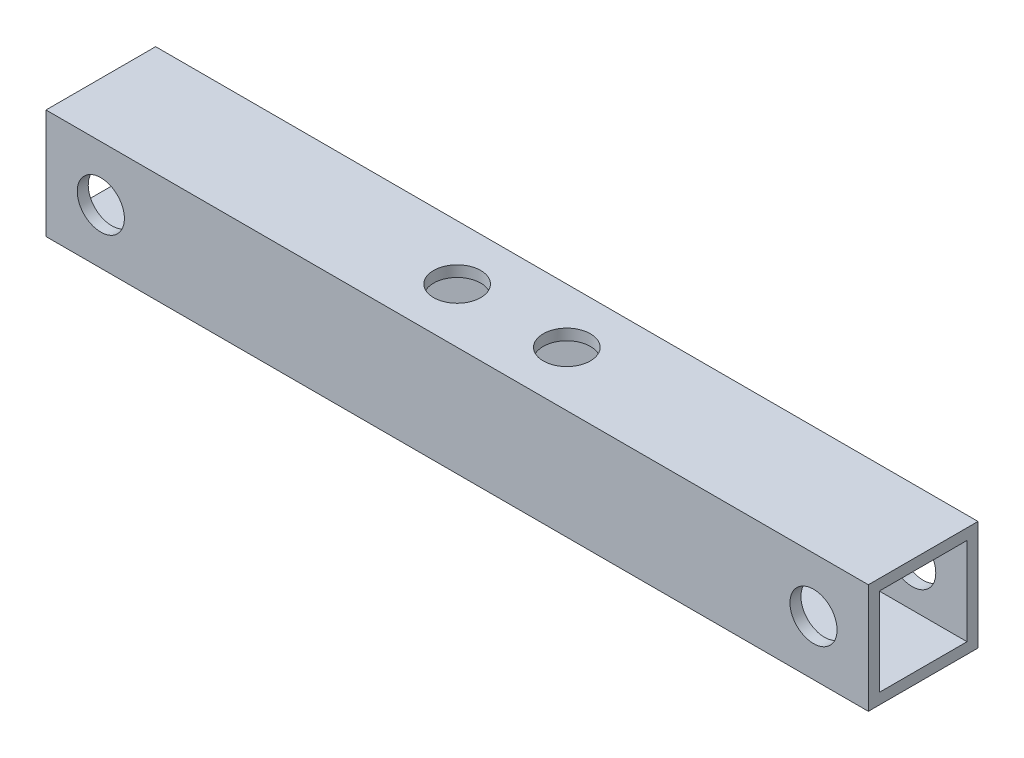
ISO-10303-21;
HEADER;
FILE_DESCRIPTION(('STEP AP214'),'2;1');
FILE_NAME('part.step','',(''),(''),'','','');
FILE_SCHEMA(('AUTOMOTIVE_DESIGN { 1 0 10303 214 1 1 1 1 }'));
ENDSEC;
DATA;
#1=APPLICATION_CONTEXT('core data for automotive mechanical design processes');
#2=APPLICATION_PROTOCOL_DEFINITION('international standard','automotive_design',2000,#1);
#3=PRODUCT_CONTEXT('',#1,'mechanical');
#4=PRODUCT('Part','Part','',(#3));
#5=PRODUCT_RELATED_PRODUCT_CATEGORY('part','',(#4));
#6=PRODUCT_DEFINITION_FORMATION('','',#4);
#7=PRODUCT_DEFINITION_CONTEXT('part definition',#1,'design');
#8=PRODUCT_DEFINITION('design','',#6,#7);
#9=PRODUCT_DEFINITION_SHAPE('','',#8);
#10=(LENGTH_UNIT() NAMED_UNIT(*) SI_UNIT(.MILLI.,.METRE.));
#11=(NAMED_UNIT(*) PLANE_ANGLE_UNIT() SI_UNIT($,.RADIAN.));
#12=(NAMED_UNIT(*) SI_UNIT($,.STERADIAN.) SOLID_ANGLE_UNIT());
#13=UNCERTAINTY_MEASURE_WITH_UNIT(LENGTH_MEASURE(1.E-05),#10,'distance_accuracy_value','');
#14=(GEOMETRIC_REPRESENTATION_CONTEXT(3) GLOBAL_UNCERTAINTY_ASSIGNED_CONTEXT((#13)) GLOBAL_UNIT_ASSIGNED_CONTEXT((#10,
#11,#12)) REPRESENTATION_CONTEXT('',''));
#15=CARTESIAN_POINT('',(0.,0.,0.));
#16=DIRECTION('',(0.,0.,1.));
#17=DIRECTION('',(1.,0.,0.));
#18=AXIS2_PLACEMENT_3D('',#15,#16,#17);
#19=CARTESIAN_POINT('',(75.,0.,0.));
#20=DIRECTION('',(1.,0.,0.));
#21=DIRECTION('',(0.,0.,-1.));
#22=AXIS2_PLACEMENT_3D('',#19,#20,#21);
#23=PLANE('',#22);
#24=DIRECTION('',(0.,1.,0.));
#25=VECTOR('',#24,1.);
#26=CARTESIAN_POINT('',(75.,5.,-5.));
#27=LINE('',#26,#25);
#28=CARTESIAN_POINT('',(75.,-5.,-5.));
#29=VERTEX_POINT('',#28);
#30=CARTESIAN_POINT('',(75.,5.,-5.));
#31=VERTEX_POINT('',#30);
#32=EDGE_CURVE('E163',#29,#31,#27,.T.);
#33=ORIENTED_EDGE('',*,*,#32,.T.);
#34=DIRECTION('',(0.,0.,1.));
#35=VECTOR('',#34,1.);
#36=CARTESIAN_POINT('',(75.,5.,5.));
#37=LINE('',#36,#35);
#38=CARTESIAN_POINT('',(75.,5.,5.));
#39=VERTEX_POINT('',#38);
#40=EDGE_CURVE('E166',#31,#39,#37,.T.);
#41=ORIENTED_EDGE('',*,*,#40,.T.);
#42=DIRECTION('',(0.,-1.,0.));
#43=VECTOR('',#42,1.);
#44=CARTESIAN_POINT('',(75.,5.,5.));
#45=LINE('',#44,#43);
#46=CARTESIAN_POINT('',(75.,-5.,5.));
#47=VERTEX_POINT('',#46);
#48=EDGE_CURVE('E169',#39,#47,#45,.T.);
#49=ORIENTED_EDGE('',*,*,#48,.T.);
#50=DIRECTION('',(0.,0.,-1.));
#51=VECTOR('',#50,1.);
#52=CARTESIAN_POINT('',(75.,-5.,5.));
#53=LINE('',#52,#51);
#54=EDGE_CURVE('E171',#47,#29,#53,.T.);
#55=ORIENTED_EDGE('',*,*,#54,.T.);
#56=EDGE_LOOP('',(#33,#41,#49,#55));
#57=FACE_BOUND('',#56,.T.);
#58=DIRECTION('',(0.,0.,1.));
#59=VECTOR('',#58,1.);
#60=CARTESIAN_POINT('',(75.,4.,5.));
#61=LINE('',#60,#59);
#62=CARTESIAN_POINT('',(75.,4.,-4.));
#63=VERTEX_POINT('',#62);
#64=CARTESIAN_POINT('',(75.,4.,4.));
#65=VERTEX_POINT('',#64);
#66=EDGE_CURVE('E133',#63,#65,#61,.T.);
#67=ORIENTED_EDGE('',*,*,#66,.F.);
#68=DIRECTION('',(0.,1.,0.));
#69=VECTOR('',#68,1.);
#70=CARTESIAN_POINT('',(75.,5.,-4.));
#71=LINE('',#70,#69);
#72=CARTESIAN_POINT('',(75.,-4.,-4.));
#73=VERTEX_POINT('',#72);
#74=EDGE_CURVE('E125',#73,#63,#71,.T.);
#75=ORIENTED_EDGE('',*,*,#74,.F.);
#76=DIRECTION('',(0.,0.,-1.));
#77=VECTOR('',#76,1.);
#78=CARTESIAN_POINT('',(75.,-4.,5.));
#79=LINE('',#78,#77);
#80=CARTESIAN_POINT('',(75.,-4.,4.));
#81=VERTEX_POINT('',#80);
#82=EDGE_CURVE('E147',#81,#73,#79,.T.);
#83=ORIENTED_EDGE('',*,*,#82,.F.);
#84=DIRECTION('',(0.,-1.,0.));
#85=VECTOR('',#84,1.);
#86=CARTESIAN_POINT('',(75.,5.,4.));
#87=LINE('',#86,#85);
#88=EDGE_CURVE('E145',#65,#81,#87,.T.);
#89=ORIENTED_EDGE('',*,*,#88,.F.);
#90=EDGE_LOOP('',(#67,#75,#83,#89));
#91=FACE_BOUND('',#90,.T.);
#92=ADVANCED_FACE('F58',(#57,#91),#23,.T.);
#93=CARTESIAN_POINT('',(0.,0.,0.));
#94=DIRECTION('',(1.,0.,0.));
#95=DIRECTION('',(0.,0.,-1.));
#96=AXIS2_PLACEMENT_3D('',#93,#94,#95);
#97=PLANE('',#96);
#98=DIRECTION('',(0.,1.,0.));
#99=VECTOR('',#98,1.);
#100=CARTESIAN_POINT('',(0.,5.,-5.));
#101=LINE('',#100,#99);
#102=CARTESIAN_POINT('',(0.,-5.,-5.));
#103=VERTEX_POINT('',#102);
#104=CARTESIAN_POINT('',(0.,5.,-5.));
#105=VERTEX_POINT('',#104);
#106=EDGE_CURVE('E141',#103,#105,#101,.T.);
#107=ORIENTED_EDGE('',*,*,#106,.F.);
#108=DIRECTION('',(0.,0.,-1.));
#109=VECTOR('',#108,1.);
#110=CARTESIAN_POINT('',(0.,-5.,5.));
#111=LINE('',#110,#109);
#112=CARTESIAN_POINT('',(0.,-5.,5.));
#113=VERTEX_POINT('',#112);
#114=EDGE_CURVE('E167',#113,#103,#111,.T.);
#115=ORIENTED_EDGE('',*,*,#114,.F.);
#116=DIRECTION('',(0.,-1.,0.));
#117=VECTOR('',#116,1.);
#118=CARTESIAN_POINT('',(0.,5.,5.));
#119=LINE('',#118,#117);
#120=CARTESIAN_POINT('',(0.,5.,5.));
#121=VERTEX_POINT('',#120);
#122=EDGE_CURVE('E178',#121,#113,#119,.T.);
#123=ORIENTED_EDGE('',*,*,#122,.F.);
#124=DIRECTION('',(0.,0.,1.));
#125=VECTOR('',#124,1.);
#126=CARTESIAN_POINT('',(0.,5.,5.));
#127=LINE('',#126,#125);
#128=EDGE_CURVE('E176',#105,#121,#127,.T.);
#129=ORIENTED_EDGE('',*,*,#128,.F.);
#130=EDGE_LOOP('',(#107,#115,#123,#129));
#131=FACE_BOUND('',#130,.T.);
#132=DIRECTION('',(0.,1.,0.));
#133=VECTOR('',#132,1.);
#134=CARTESIAN_POINT('',(0.,5.,-4.));
#135=LINE('',#134,#133);
#136=CARTESIAN_POINT('',(0.,-4.,-4.));
#137=VERTEX_POINT('',#136);
#138=CARTESIAN_POINT('',(0.,4.,-4.));
#139=VERTEX_POINT('',#138);
#140=EDGE_CURVE('E83',#137,#139,#135,.T.);
#141=ORIENTED_EDGE('',*,*,#140,.T.);
#142=DIRECTION('',(0.,0.,1.));
#143=VECTOR('',#142,1.);
#144=CARTESIAN_POINT('',(0.,4.,5.));
#145=LINE('',#144,#143);
#146=CARTESIAN_POINT('',(0.,4.,4.));
#147=VERTEX_POINT('',#146);
#148=EDGE_CURVE('E140',#139,#147,#145,.T.);
#149=ORIENTED_EDGE('',*,*,#148,.T.);
#150=DIRECTION('',(0.,-1.,0.));
#151=VECTOR('',#150,1.);
#152=CARTESIAN_POINT('',(0.,5.,4.));
#153=LINE('',#152,#151);
#154=CARTESIAN_POINT('',(0.,-4.,4.));
#155=VERTEX_POINT('',#154);
#156=EDGE_CURVE('E155',#147,#155,#153,.T.);
#157=ORIENTED_EDGE('',*,*,#156,.T.);
#158=DIRECTION('',(0.,0.,-1.));
#159=VECTOR('',#158,1.);
#160=CARTESIAN_POINT('',(0.,-4.,5.));
#161=LINE('',#160,#159);
#162=EDGE_CURVE('E134',#155,#137,#161,.T.);
#163=ORIENTED_EDGE('',*,*,#162,.T.);
#164=EDGE_LOOP('',(#141,#149,#157,#163));
#165=FACE_BOUND('',#164,.T.);
#166=ADVANCED_FACE('F255',(#131,#165),#97,.F.);
#167=CARTESIAN_POINT('',(75.,5.,-5.));
#168=DIRECTION('',(0.,0.,1.));
#169=DIRECTION('',(0.,-1.,0.));
#170=AXIS2_PLACEMENT_3D('',#167,#168,#169);
#171=PLANE('',#170);
#172=CARTESIAN_POINT('',(70.,0.,-5.));
#173=DIRECTION('',(0.,0.,1.));
#174=DIRECTION('',(1.,0.,0.));
#175=AXIS2_PLACEMENT_3D('',#172,#173,#174);
#176=CIRCLE('',#175,2.15);
#177=CARTESIAN_POINT('',(72.15,0.,-5.));
#178=VERTEX_POINT('',#177);
#179=EDGE_CURVE('E192',#178,#178,#176,.T.);
#180=ORIENTED_EDGE('',*,*,#179,.T.);
#181=EDGE_LOOP('',(#180));
#182=FACE_BOUND('',#181,.T.);
#183=CARTESIAN_POINT('',(5.,0.,-5.));
#184=DIRECTION('',(0.,0.,1.));
#185=DIRECTION('',(-1.,0.,0.));
#186=AXIS2_PLACEMENT_3D('',#183,#184,#185);
#187=CIRCLE('',#186,2.15);
#188=CARTESIAN_POINT('',(2.85,0.,-5.));
#189=VERTEX_POINT('',#188);
#190=EDGE_CURVE('E226',#189,#189,#187,.T.);
#191=ORIENTED_EDGE('',*,*,#190,.T.);
#192=EDGE_LOOP('',(#191));
#193=FACE_BOUND('',#192,.T.);
#194=ORIENTED_EDGE('',*,*,#106,.T.);
#195=DIRECTION('',(-1.,0.,0.));
#196=VECTOR('',#195,1.);
#197=CARTESIAN_POINT('',(75.,5.,-5.));
#198=LINE('',#197,#196);
#199=EDGE_CURVE('E12',#31,#105,#198,.T.);
#200=ORIENTED_EDGE('',*,*,#199,.F.);
#201=ORIENTED_EDGE('',*,*,#32,.F.);
#202=DIRECTION('',(-1.,0.,0.));
#203=VECTOR('',#202,1.);
#204=CARTESIAN_POINT('',(75.,-5.,-5.));
#205=LINE('',#204,#203);
#206=EDGE_CURVE('E173',#29,#103,#205,.T.);
#207=ORIENTED_EDGE('',*,*,#206,.T.);
#208=EDGE_LOOP('',(#194,#200,#201,#207));
#209=FACE_BOUND('',#208,.T.);
#210=ADVANCED_FACE('F60',(#182,#193,#209),#171,.F.);
#211=CARTESIAN_POINT('',(75.,5.,5.));
#212=DIRECTION('',(0.,-1.,0.));
#213=DIRECTION('',(0.,0.,-1.));
#214=AXIS2_PLACEMENT_3D('',#211,#212,#213);
#215=PLANE('',#214);
#216=CARTESIAN_POINT('',(42.5,5.,0.));
#217=DIRECTION('',(0.,1.,0.));
#218=DIRECTION('',(0.,0.,1.));
#219=AXIS2_PLACEMENT_3D('',#216,#217,#218);
#220=CIRCLE('',#219,2.15);
#221=CARTESIAN_POINT('',(42.5,5.,2.15));
#222=VERTEX_POINT('',#221);
#223=EDGE_CURVE('E204',#222,#222,#220,.T.);
#224=ORIENTED_EDGE('',*,*,#223,.F.);
#225=EDGE_LOOP('',(#224));
#226=FACE_BOUND('',#225,.T.);
#227=CARTESIAN_POINT('',(32.5,5.,0.));
#228=DIRECTION('',(0.,1.,0.));
#229=DIRECTION('',(0.,0.,-1.));
#230=AXIS2_PLACEMENT_3D('',#227,#228,#229);
#231=CIRCLE('',#230,2.15);
#232=CARTESIAN_POINT('',(32.5,5.,-2.15));
#233=VERTEX_POINT('',#232);
#234=EDGE_CURVE('E214',#233,#233,#231,.T.);
#235=ORIENTED_EDGE('',*,*,#234,.F.);
#236=EDGE_LOOP('',(#235));
#237=FACE_BOUND('',#236,.T.);
#238=ORIENTED_EDGE('',*,*,#128,.T.);
#239=DIRECTION('',(-1.,0.,0.));
#240=VECTOR('',#239,1.);
#241=CARTESIAN_POINT('',(75.,5.,5.));
#242=LINE('',#241,#240);
#243=EDGE_CURVE('E67',#39,#121,#242,.T.);
#244=ORIENTED_EDGE('',*,*,#243,.F.);
#245=ORIENTED_EDGE('',*,*,#40,.F.);
#246=ORIENTED_EDGE('',*,*,#199,.T.);
#247=EDGE_LOOP('',(#238,#244,#245,#246));
#248=FACE_BOUND('',#247,.T.);
#249=ADVANCED_FACE('F254',(#226,#237,#248),#215,.F.);
#250=CARTESIAN_POINT('',(75.,5.,5.));
#251=DIRECTION('',(0.,0.,-1.));
#252=DIRECTION('',(0.,1.,0.));
#253=AXIS2_PLACEMENT_3D('',#250,#251,#252);
#254=PLANE('',#253);
#255=CARTESIAN_POINT('',(70.,0.,5.));
#256=DIRECTION('',(0.,0.,1.));
#257=DIRECTION('',(1.,0.,0.));
#258=AXIS2_PLACEMENT_3D('',#255,#256,#257);
#259=CIRCLE('',#258,2.15);
#260=CARTESIAN_POINT('',(72.15,0.,5.));
#261=VERTEX_POINT('',#260);
#262=EDGE_CURVE('E223',#261,#261,#259,.T.);
#263=ORIENTED_EDGE('',*,*,#262,.F.);
#264=EDGE_LOOP('',(#263));
#265=FACE_BOUND('',#264,.T.);
#266=CARTESIAN_POINT('',(5.,0.,5.));
#267=DIRECTION('',(0.,0.,1.));
#268=DIRECTION('',(-1.,0.,0.));
#269=AXIS2_PLACEMENT_3D('',#266,#267,#268);
#270=CIRCLE('',#269,2.15);
#271=CARTESIAN_POINT('',(2.85,0.,5.));
#272=VERTEX_POINT('',#271);
#273=EDGE_CURVE('E220',#272,#272,#270,.T.);
#274=ORIENTED_EDGE('',*,*,#273,.F.);
#275=EDGE_LOOP('',(#274));
#276=FACE_BOUND('',#275,.T.);
#277=ORIENTED_EDGE('',*,*,#122,.T.);
#278=DIRECTION('',(-1.,0.,0.));
#279=VECTOR('',#278,1.);
#280=CARTESIAN_POINT('',(75.,-5.,5.));
#281=LINE('',#280,#279);
#282=EDGE_CURVE('E183',#47,#113,#281,.T.);
#283=ORIENTED_EDGE('',*,*,#282,.F.);
#284=ORIENTED_EDGE('',*,*,#48,.F.);
#285=ORIENTED_EDGE('',*,*,#243,.T.);
#286=EDGE_LOOP('',(#277,#283,#284,#285));
#287=FACE_BOUND('',#286,.T.);
#288=ADVANCED_FACE('F273',(#265,#276,#287),#254,.F.);
#289=CARTESIAN_POINT('',(75.,-5.,5.));
#290=DIRECTION('',(0.,1.,0.));
#291=DIRECTION('',(0.,0.,1.));
#292=AXIS2_PLACEMENT_3D('',#289,#290,#291);
#293=PLANE('',#292);
#294=CARTESIAN_POINT('',(42.5,-5.,0.));
#295=DIRECTION('',(0.,1.,0.));
#296=DIRECTION('',(0.,0.,1.));
#297=AXIS2_PLACEMENT_3D('',#294,#295,#296);
#298=CIRCLE('',#297,2.15);
#299=CARTESIAN_POINT('',(42.5,-5.,2.15));
#300=VERTEX_POINT('',#299);
#301=EDGE_CURVE('E198',#300,#300,#298,.T.);
#302=ORIENTED_EDGE('',*,*,#301,.T.);
#303=EDGE_LOOP('',(#302));
#304=FACE_BOUND('',#303,.T.);
#305=CARTESIAN_POINT('',(32.5,-5.,0.));
#306=DIRECTION('',(0.,1.,0.));
#307=DIRECTION('',(0.,0.,-1.));
#308=AXIS2_PLACEMENT_3D('',#305,#306,#307);
#309=CIRCLE('',#308,2.15);
#310=CARTESIAN_POINT('',(32.5,-5.,-2.15));
#311=VERTEX_POINT('',#310);
#312=EDGE_CURVE('E209',#311,#311,#309,.T.);
#313=ORIENTED_EDGE('',*,*,#312,.T.);
#314=EDGE_LOOP('',(#313));
#315=FACE_BOUND('',#314,.T.);
#316=ORIENTED_EDGE('',*,*,#114,.T.);
#317=ORIENTED_EDGE('',*,*,#206,.F.);
#318=ORIENTED_EDGE('',*,*,#54,.F.);
#319=ORIENTED_EDGE('',*,*,#282,.T.);
#320=EDGE_LOOP('',(#316,#317,#318,#319));
#321=FACE_BOUND('',#320,.T.);
#322=ADVANCED_FACE('F240',(#304,#315,#321),#293,.F.);
#323=CARTESIAN_POINT('',(75.,5.,-4.));
#324=DIRECTION('',(0.,0.,1.));
#325=DIRECTION('',(0.,-1.,0.));
#326=AXIS2_PLACEMENT_3D('',#323,#324,#325);
#327=PLANE('',#326);
#328=CARTESIAN_POINT('',(70.,0.,-4.));
#329=DIRECTION('',(0.,0.,1.));
#330=DIRECTION('',(0.,-1.,0.));
#331=AXIS2_PLACEMENT_3D('',#328,#329,#330);
#332=CIRCLE('',#331,2.15);
#333=CARTESIAN_POINT('',(70.,-2.15,-4.));
#334=VERTEX_POINT('',#333);
#335=EDGE_CURVE('E153',#334,#334,#332,.T.);
#336=ORIENTED_EDGE('',*,*,#335,.F.);
#337=EDGE_LOOP('',(#336));
#338=FACE_BOUND('',#337,.T.);
#339=CARTESIAN_POINT('',(5.,0.,-4.));
#340=DIRECTION('',(0.,0.,1.));
#341=DIRECTION('',(0.,-1.,0.));
#342=AXIS2_PLACEMENT_3D('',#339,#340,#341);
#343=CIRCLE('',#342,2.15);
#344=CARTESIAN_POINT('',(5.,-2.15,-4.));
#345=VERTEX_POINT('',#344);
#346=EDGE_CURVE('E191',#345,#345,#343,.T.);
#347=ORIENTED_EDGE('',*,*,#346,.F.);
#348=EDGE_LOOP('',(#347));
#349=FACE_BOUND('',#348,.T.);
#350=ORIENTED_EDGE('',*,*,#140,.F.);
#351=DIRECTION('',(-1.,0.,0.));
#352=VECTOR('',#351,1.);
#353=CARTESIAN_POINT('',(75.,-4.,-4.));
#354=LINE('',#353,#352);
#355=EDGE_CURVE('E129',#73,#137,#354,.T.);
#356=ORIENTED_EDGE('',*,*,#355,.F.);
#357=ORIENTED_EDGE('',*,*,#74,.T.);
#358=DIRECTION('',(-1.,0.,0.));
#359=VECTOR('',#358,1.);
#360=CARTESIAN_POINT('',(75.,4.,-4.));
#361=LINE('',#360,#359);
#362=EDGE_CURVE('E128',#63,#139,#361,.T.);
#363=ORIENTED_EDGE('',*,*,#362,.T.);
#364=EDGE_LOOP('',(#350,#356,#357,#363));
#365=FACE_BOUND('',#364,.T.);
#366=ADVANCED_FACE('F127',(#338,#349,#365),#327,.T.);
#367=CARTESIAN_POINT('',(75.,4.,5.));
#368=DIRECTION('',(0.,-1.,0.));
#369=DIRECTION('',(0.,0.,-1.));
#370=AXIS2_PLACEMENT_3D('',#367,#368,#369);
#371=PLANE('',#370);
#372=CARTESIAN_POINT('',(42.5,4.,0.));
#373=DIRECTION('',(0.,-1.,0.));
#374=DIRECTION('',(0.,0.,-1.));
#375=AXIS2_PLACEMENT_3D('',#372,#373,#374);
#376=CIRCLE('',#375,2.15);
#377=CARTESIAN_POINT('',(42.5,4.,-2.15));
#378=VERTEX_POINT('',#377);
#379=EDGE_CURVE('E217',#378,#378,#376,.T.);
#380=ORIENTED_EDGE('',*,*,#379,.F.);
#381=EDGE_LOOP('',(#380));
#382=FACE_BOUND('',#381,.T.);
#383=CARTESIAN_POINT('',(32.5,4.,0.));
#384=DIRECTION('',(0.,-1.,0.));
#385=DIRECTION('',(0.,0.,-1.));
#386=AXIS2_PLACEMENT_3D('',#383,#384,#385);
#387=CIRCLE('',#386,2.15);
#388=CARTESIAN_POINT('',(32.5,4.,-2.15));
#389=VERTEX_POINT('',#388);
#390=EDGE_CURVE('E197',#389,#389,#387,.T.);
#391=ORIENTED_EDGE('',*,*,#390,.F.);
#392=EDGE_LOOP('',(#391));
#393=FACE_BOUND('',#392,.T.);
#394=ORIENTED_EDGE('',*,*,#148,.F.);
#395=ORIENTED_EDGE('',*,*,#362,.F.);
#396=ORIENTED_EDGE('',*,*,#66,.T.);
#397=DIRECTION('',(-1.,0.,0.));
#398=VECTOR('',#397,1.);
#399=CARTESIAN_POINT('',(75.,4.,4.));
#400=LINE('',#399,#398);
#401=EDGE_CURVE('E142',#65,#147,#400,.T.);
#402=ORIENTED_EDGE('',*,*,#401,.T.);
#403=EDGE_LOOP('',(#394,#395,#396,#402));
#404=FACE_BOUND('',#403,.T.);
#405=ADVANCED_FACE('F137',(#382,#393,#404),#371,.T.);
#406=CARTESIAN_POINT('',(75.,5.,4.));
#407=DIRECTION('',(0.,0.,-1.));
#408=DIRECTION('',(0.,1.,0.));
#409=AXIS2_PLACEMENT_3D('',#406,#407,#408);
#410=PLANE('',#409);
#411=CARTESIAN_POINT('',(70.,0.,4.));
#412=DIRECTION('',(0.,0.,-1.));
#413=DIRECTION('',(0.,1.,0.));
#414=AXIS2_PLACEMENT_3D('',#411,#412,#413);
#415=CIRCLE('',#414,2.15);
#416=CARTESIAN_POINT('',(70.,2.15,4.));
#417=VERTEX_POINT('',#416);
#418=EDGE_CURVE('E193',#417,#417,#415,.T.);
#419=ORIENTED_EDGE('',*,*,#418,.F.);
#420=EDGE_LOOP('',(#419));
#421=FACE_BOUND('',#420,.T.);
#422=CARTESIAN_POINT('',(5.,0.,4.));
#423=DIRECTION('',(0.,0.,-1.));
#424=DIRECTION('',(0.,1.,0.));
#425=AXIS2_PLACEMENT_3D('',#422,#423,#424);
#426=CIRCLE('',#425,2.15);
#427=CARTESIAN_POINT('',(5.,2.15,4.));
#428=VERTEX_POINT('',#427);
#429=EDGE_CURVE('E188',#428,#428,#426,.T.);
#430=ORIENTED_EDGE('',*,*,#429,.F.);
#431=EDGE_LOOP('',(#430));
#432=FACE_BOUND('',#431,.T.);
#433=ORIENTED_EDGE('',*,*,#156,.F.);
#434=ORIENTED_EDGE('',*,*,#401,.F.);
#435=ORIENTED_EDGE('',*,*,#88,.T.);
#436=DIRECTION('',(-1.,0.,0.));
#437=VECTOR('',#436,1.);
#438=CARTESIAN_POINT('',(75.,-4.,4.));
#439=LINE('',#438,#437);
#440=EDGE_CURVE('E75',#81,#155,#439,.T.);
#441=ORIENTED_EDGE('',*,*,#440,.T.);
#442=EDGE_LOOP('',(#433,#434,#435,#441));
#443=FACE_BOUND('',#442,.T.);
#444=ADVANCED_FACE('F294',(#421,#432,#443),#410,.T.);
#445=CARTESIAN_POINT('',(75.,-4.,5.));
#446=DIRECTION('',(0.,1.,0.));
#447=DIRECTION('',(0.,0.,1.));
#448=AXIS2_PLACEMENT_3D('',#445,#446,#447);
#449=PLANE('',#448);
#450=CARTESIAN_POINT('',(42.5,-4.,0.));
#451=DIRECTION('',(0.,1.,0.));
#452=DIRECTION('',(0.,0.,1.));
#453=AXIS2_PLACEMENT_3D('',#450,#451,#452);
#454=CIRCLE('',#453,2.15);
#455=CARTESIAN_POINT('',(42.5,-4.,2.15));
#456=VERTEX_POINT('',#455);
#457=EDGE_CURVE('E62',#456,#456,#454,.T.);
#458=ORIENTED_EDGE('',*,*,#457,.F.);
#459=EDGE_LOOP('',(#458));
#460=FACE_BOUND('',#459,.T.);
#461=CARTESIAN_POINT('',(32.5,-4.,0.));
#462=DIRECTION('',(0.,1.,0.));
#463=DIRECTION('',(0.,0.,1.));
#464=AXIS2_PLACEMENT_3D('',#461,#462,#463);
#465=CIRCLE('',#464,2.15);
#466=CARTESIAN_POINT('',(32.5,-4.,2.15));
#467=VERTEX_POINT('',#466);
#468=EDGE_CURVE('E195',#467,#467,#465,.T.);
#469=ORIENTED_EDGE('',*,*,#468,.F.);
#470=EDGE_LOOP('',(#469));
#471=FACE_BOUND('',#470,.T.);
#472=ORIENTED_EDGE('',*,*,#162,.F.);
#473=ORIENTED_EDGE('',*,*,#440,.F.);
#474=ORIENTED_EDGE('',*,*,#82,.T.);
#475=ORIENTED_EDGE('',*,*,#355,.T.);
#476=EDGE_LOOP('',(#472,#473,#474,#475));
#477=FACE_BOUND('',#476,.T.);
#478=ADVANCED_FACE('F298',(#460,#471,#477),#449,.T.);
#479=CARTESIAN_POINT('',(5.,0.,-5.));
#480=DIRECTION('',(0.,0.,1.));
#481=DIRECTION('',(1.,0.,0.));
#482=AXIS2_PLACEMENT_3D('',#479,#480,#481);
#483=CYLINDRICAL_SURFACE('',#482,2.15);
#484=ORIENTED_EDGE('',*,*,#429,.T.);
#485=EDGE_LOOP('',(#484));
#486=FACE_BOUND('',#485,.T.);
#487=ORIENTED_EDGE('',*,*,#273,.T.);
#488=EDGE_LOOP('',(#487));
#489=FACE_BOUND('',#488,.T.);
#490=ADVANCED_FACE('F249',(#486,#489),#483,.F.);
#491=CARTESIAN_POINT('',(70.,0.,-5.));
#492=DIRECTION('',(0.,0.,1.));
#493=DIRECTION('',(1.,0.,0.));
#494=AXIS2_PLACEMENT_3D('',#491,#492,#493);
#495=CYLINDRICAL_SURFACE('',#494,2.15);
#496=ORIENTED_EDGE('',*,*,#418,.T.);
#497=EDGE_LOOP('',(#496));
#498=FACE_BOUND('',#497,.T.);
#499=ORIENTED_EDGE('',*,*,#262,.T.);
#500=EDGE_LOOP('',(#499));
#501=FACE_BOUND('',#500,.T.);
#502=ADVANCED_FACE('F247',(#498,#501),#495,.F.);
#503=ORIENTED_EDGE('',*,*,#346,.T.);
#504=EDGE_LOOP('',(#503));
#505=FACE_BOUND('',#504,.T.);
#506=ORIENTED_EDGE('',*,*,#190,.F.);
#507=EDGE_LOOP('',(#506));
#508=FACE_BOUND('',#507,.T.);
#509=ADVANCED_FACE('F244',(#505,#508),#483,.F.);
#510=ORIENTED_EDGE('',*,*,#335,.T.);
#511=EDGE_LOOP('',(#510));
#512=FACE_BOUND('',#511,.T.);
#513=ORIENTED_EDGE('',*,*,#179,.F.);
#514=EDGE_LOOP('',(#513));
#515=FACE_BOUND('',#514,.T.);
#516=ADVANCED_FACE('F235',(#512,#515),#495,.F.);
#517=CARTESIAN_POINT('',(32.5,-5.,0.));
#518=DIRECTION('',(0.,1.,0.));
#519=DIRECTION('',(0.,0.,1.));
#520=AXIS2_PLACEMENT_3D('',#517,#518,#519);
#521=CYLINDRICAL_SURFACE('',#520,2.15);
#522=ORIENTED_EDGE('',*,*,#468,.T.);
#523=EDGE_LOOP('',(#522));
#524=FACE_BOUND('',#523,.T.);
#525=ORIENTED_EDGE('',*,*,#312,.F.);
#526=EDGE_LOOP('',(#525));
#527=FACE_BOUND('',#526,.T.);
#528=ADVANCED_FACE('F308',(#524,#527),#521,.F.);
#529=CARTESIAN_POINT('',(42.5,-5.,0.));
#530=DIRECTION('',(0.,1.,0.));
#531=DIRECTION('',(0.,0.,1.));
#532=AXIS2_PLACEMENT_3D('',#529,#530,#531);
#533=CYLINDRICAL_SURFACE('',#532,2.15);
#534=ORIENTED_EDGE('',*,*,#457,.T.);
#535=EDGE_LOOP('',(#534));
#536=FACE_BOUND('',#535,.T.);
#537=ORIENTED_EDGE('',*,*,#301,.F.);
#538=EDGE_LOOP('',(#537));
#539=FACE_BOUND('',#538,.T.);
#540=ADVANCED_FACE('F311',(#536,#539),#533,.F.);
#541=ORIENTED_EDGE('',*,*,#390,.T.);
#542=EDGE_LOOP('',(#541));
#543=FACE_BOUND('',#542,.T.);
#544=ORIENTED_EDGE('',*,*,#234,.T.);
#545=EDGE_LOOP('',(#544));
#546=FACE_BOUND('',#545,.T.);
#547=ADVANCED_FACE('F312',(#543,#546),#521,.F.);
#548=ORIENTED_EDGE('',*,*,#379,.T.);
#549=EDGE_LOOP('',(#548));
#550=FACE_BOUND('',#549,.T.);
#551=ORIENTED_EDGE('',*,*,#223,.T.);
#552=EDGE_LOOP('',(#551));
#553=FACE_BOUND('',#552,.T.);
#554=ADVANCED_FACE('F315',(#550,#553),#533,.F.);
#555=CLOSED_SHELL('',(#92,#166,#210,#249,#288,#322,#366,#405,#444,#478,#490,#502,#509,#516,#528,
#540,#547,#554));
#556=MANIFOLD_SOLID_BREP('B2',#555);
#557=ADVANCED_BREP_SHAPE_REPRESENTATION('',(#18,#556),#14);
#558=SHAPE_DEFINITION_REPRESENTATION(#9,#557);
ENDSEC;
END-ISO-10303-21;
